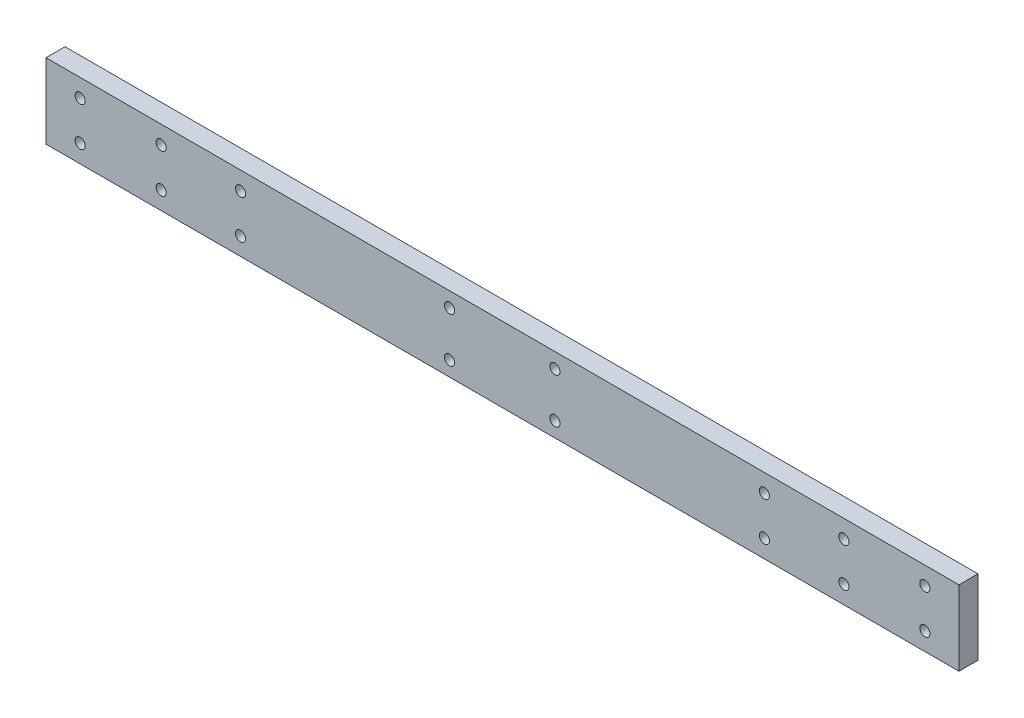
ISO-10303-21;
HEADER;
FILE_DESCRIPTION(('STEP AP214'),'2;1');
FILE_NAME('part.step','',(''),(''),'','','');
FILE_SCHEMA(('AUTOMOTIVE_DESIGN { 1 0 10303 214 1 1 1 1 }'));
ENDSEC;
DATA;
#1=APPLICATION_CONTEXT('core data for automotive mechanical design processes');
#2=APPLICATION_PROTOCOL_DEFINITION('international standard','automotive_design',2000,#1);
#3=PRODUCT_CONTEXT('',#1,'mechanical');
#4=PRODUCT('Part','Part','',(#3));
#5=PRODUCT_RELATED_PRODUCT_CATEGORY('part','',(#4));
#6=PRODUCT_DEFINITION_FORMATION('','',#4);
#7=PRODUCT_DEFINITION_CONTEXT('part definition',#1,'design');
#8=PRODUCT_DEFINITION('design','',#6,#7);
#9=PRODUCT_DEFINITION_SHAPE('','',#8);
#10=(LENGTH_UNIT() NAMED_UNIT(*) SI_UNIT(.MILLI.,.METRE.));
#11=(NAMED_UNIT(*) PLANE_ANGLE_UNIT() SI_UNIT($,.RADIAN.));
#12=(NAMED_UNIT(*) SI_UNIT($,.STERADIAN.) SOLID_ANGLE_UNIT());
#13=UNCERTAINTY_MEASURE_WITH_UNIT(LENGTH_MEASURE(1.E-05),#10,'distance_accuracy_value','');
#14=(GEOMETRIC_REPRESENTATION_CONTEXT(3) GLOBAL_UNCERTAINTY_ASSIGNED_CONTEXT((#13)) GLOBAL_UNIT_ASSIGNED_CONTEXT((#10,
#11,#12)) REPRESENTATION_CONTEXT('',''));
#15=CARTESIAN_POINT('',(0.,0.,0.));
#16=DIRECTION('',(0.,0.,1.));
#17=DIRECTION('',(1.,0.,0.));
#18=AXIS2_PLACEMENT_3D('',#15,#16,#17);
#19=CARTESIAN_POINT('',(264.023766162715,0.,6.35));
#20=DIRECTION('',(1.,0.,0.));
#21=DIRECTION('',(0.,0.,-1.));
#22=AXIS2_PLACEMENT_3D('',#19,#20,#21);
#23=PLANE('',#22);
#24=DIRECTION('',(0.,-1.,0.));
#25=VECTOR('',#24,1.);
#26=CARTESIAN_POINT('',(264.023766162715,0.,0.));
#27=LINE('',#26,#25);
#28=CARTESIAN_POINT('',(264.023766162715,235.923622409626,0.));
#29=VERTEX_POINT('',#28);
#30=CARTESIAN_POINT('',(264.023766162715,210.923622409626,0.));
#31=VERTEX_POINT('',#30);
#32=EDGE_CURVE('E107',#29,#31,#27,.T.);
#33=ORIENTED_EDGE('',*,*,#32,.F.);
#34=DIRECTION('',(0.,0.,-1.));
#35=VECTOR('',#34,1.);
#36=CARTESIAN_POINT('',(264.023766162715,235.923622409626,6.35));
#37=LINE('',#36,#35);
#38=CARTESIAN_POINT('',(264.023766162715,235.923622409626,6.35));
#39=VERTEX_POINT('',#38);
#40=EDGE_CURVE('E12',#39,#29,#37,.T.);
#41=ORIENTED_EDGE('',*,*,#40,.F.);
#42=DIRECTION('',(0.,-1.,0.));
#43=VECTOR('',#42,1.);
#44=CARTESIAN_POINT('',(264.023766162715,0.,6.35));
#45=LINE('',#44,#43);
#46=CARTESIAN_POINT('',(264.023766162715,210.923622409626,6.35));
#47=VERTEX_POINT('',#46);
#48=EDGE_CURVE('E100',#39,#47,#45,.T.);
#49=ORIENTED_EDGE('',*,*,#48,.T.);
#50=DIRECTION('',(0.,0.,-1.));
#51=VECTOR('',#50,1.);
#52=CARTESIAN_POINT('',(264.023766162715,210.923622409626,6.35));
#53=LINE('',#52,#51);
#54=EDGE_CURVE('E80',#47,#31,#53,.T.);
#55=ORIENTED_EDGE('',*,*,#54,.T.);
#56=EDGE_LOOP('',(#33,#41,#49,#55));
#57=FACE_BOUND('',#56,.T.);
#58=ADVANCED_FACE('F39',(#57),#23,.T.);
#59=CARTESIAN_POINT('',(0.,235.923622409626,6.35));
#60=DIRECTION('',(0.,1.,0.));
#61=DIRECTION('',(0.,0.,1.));
#62=AXIS2_PLACEMENT_3D('',#59,#60,#61);
#63=PLANE('',#62);
#64=DIRECTION('',(1.,0.,0.));
#65=VECTOR('',#64,1.);
#66=CARTESIAN_POINT('',(0.,235.923622409626,0.));
#67=LINE('',#66,#65);
#68=CARTESIAN_POINT('',(-40.7762338372855,235.923622409626,0.));
#69=VERTEX_POINT('',#68);
#70=EDGE_CURVE('E93',#69,#29,#67,.T.);
#71=ORIENTED_EDGE('',*,*,#70,.F.);
#72=DIRECTION('',(0.,0.,-1.));
#73=VECTOR('',#72,1.);
#74=CARTESIAN_POINT('',(-40.7762338372855,235.923622409626,6.35));
#75=LINE('',#74,#73);
#76=CARTESIAN_POINT('',(-40.7762338372855,235.923622409626,6.35));
#77=VERTEX_POINT('',#76);
#78=EDGE_CURVE('E49',#77,#69,#75,.T.);
#79=ORIENTED_EDGE('',*,*,#78,.F.);
#80=DIRECTION('',(1.,0.,0.));
#81=VECTOR('',#80,1.);
#82=CARTESIAN_POINT('',(0.,235.923622409626,6.35));
#83=LINE('',#82,#81);
#84=EDGE_CURVE('E91',#77,#39,#83,.T.);
#85=ORIENTED_EDGE('',*,*,#84,.T.);
#86=ORIENTED_EDGE('',*,*,#40,.T.);
#87=EDGE_LOOP('',(#71,#79,#85,#86));
#88=FACE_BOUND('',#87,.T.);
#89=ADVANCED_FACE('F89',(#88),#63,.T.);
#90=CARTESIAN_POINT('',(-40.7762338372855,0.,6.35));
#91=DIRECTION('',(1.,0.,0.));
#92=DIRECTION('',(0.,0.,-1.));
#93=AXIS2_PLACEMENT_3D('',#90,#91,#92);
#94=PLANE('',#93);
#95=DIRECTION('',(0.,-1.,0.));
#96=VECTOR('',#95,1.);
#97=CARTESIAN_POINT('',(-40.7762338372855,0.,0.));
#98=LINE('',#97,#96);
#99=CARTESIAN_POINT('',(-40.7762338372855,210.923622409626,0.));
#100=VERTEX_POINT('',#99);
#101=EDGE_CURVE('E73',#69,#100,#98,.T.);
#102=ORIENTED_EDGE('',*,*,#101,.T.);
#103=DIRECTION('',(0.,0.,-1.));
#104=VECTOR('',#103,1.);
#105=CARTESIAN_POINT('',(-40.7762338372855,210.923622409626,6.35));
#106=LINE('',#105,#104);
#107=CARTESIAN_POINT('',(-40.7762338372855,210.923622409626,6.35));
#108=VERTEX_POINT('',#107);
#109=EDGE_CURVE('E94',#108,#100,#106,.T.);
#110=ORIENTED_EDGE('',*,*,#109,.F.);
#111=DIRECTION('',(0.,-1.,0.));
#112=VECTOR('',#111,1.);
#113=CARTESIAN_POINT('',(-40.7762338372855,0.,6.35));
#114=LINE('',#113,#112);
#115=EDGE_CURVE('E96',#77,#108,#114,.T.);
#116=ORIENTED_EDGE('',*,*,#115,.F.);
#117=ORIENTED_EDGE('',*,*,#78,.T.);
#118=EDGE_LOOP('',(#102,#110,#116,#117));
#119=FACE_BOUND('',#118,.T.);
#120=ADVANCED_FACE('F97',(#119),#94,.F.);
#121=CARTESIAN_POINT('',(0.,210.923622409626,6.35));
#122=DIRECTION('',(0.,1.,0.));
#123=DIRECTION('',(0.,0.,1.));
#124=AXIS2_PLACEMENT_3D('',#121,#122,#123);
#125=PLANE('',#124);
#126=DIRECTION('',(1.,0.,0.));
#127=VECTOR('',#126,1.);
#128=CARTESIAN_POINT('',(0.,210.923622409626,0.));
#129=LINE('',#128,#127);
#130=EDGE_CURVE('E102',#100,#31,#129,.T.);
#131=ORIENTED_EDGE('',*,*,#130,.T.);
#132=ORIENTED_EDGE('',*,*,#54,.F.);
#133=DIRECTION('',(1.,0.,0.));
#134=VECTOR('',#133,1.);
#135=CARTESIAN_POINT('',(0.,210.923622409626,6.35));
#136=LINE('',#135,#134);
#137=EDGE_CURVE('E58',#108,#47,#136,.T.);
#138=ORIENTED_EDGE('',*,*,#137,.F.);
#139=ORIENTED_EDGE('',*,*,#109,.T.);
#140=EDGE_LOOP('',(#131,#132,#138,#139));
#141=FACE_BOUND('',#140,.T.);
#142=ADVANCED_FACE('F228',(#141),#125,.F.);
#143=CARTESIAN_POINT('',(0.,0.,6.35));
#144=DIRECTION('',(0.,0.,1.));
#145=DIRECTION('',(1.,0.,0.));
#146=AXIS2_PLACEMENT_3D('',#143,#144,#145);
#147=PLANE('',#146);
#148=CARTESIAN_POINT('',(129.123766162715,230.923622409626,6.35));
#149=DIRECTION('',(0.,0.,1.));
#150=DIRECTION('',(1.,0.,0.));
#151=AXIS2_PLACEMENT_3D('',#148,#149,#150);
#152=CIRCLE('',#151,1.70000000000001);
#153=CARTESIAN_POINT('',(130.823766162715,230.923622409626,6.35));
#154=VERTEX_POINT('',#153);
#155=EDGE_CURVE('E429',#154,#154,#152,.T.);
#156=ORIENTED_EDGE('',*,*,#155,.F.);
#157=EDGE_LOOP('',(#156));
#158=FACE_BOUND('',#157,.T.);
#159=CARTESIAN_POINT('',(93.9601678730371,215.923622409626,6.35));
#160=DIRECTION('',(0.,0.,1.));
#161=DIRECTION('',(1.,0.,0.));
#162=AXIS2_PLACEMENT_3D('',#159,#160,#161);
#163=CIRCLE('',#162,1.70000000000001);
#164=CARTESIAN_POINT('',(95.6601678730371,215.923622409626,6.35));
#165=VERTEX_POINT('',#164);
#166=EDGE_CURVE('E431',#165,#165,#163,.T.);
#167=ORIENTED_EDGE('',*,*,#166,.F.);
#168=EDGE_LOOP('',(#167));
#169=FACE_BOUND('',#168,.T.);
#170=CARTESIAN_POINT('',(93.9601678730371,230.923622409626,6.35));
#171=DIRECTION('',(0.,0.,1.));
#172=DIRECTION('',(1.,0.,0.));
#173=AXIS2_PLACEMENT_3D('',#170,#171,#172);
#174=CIRCLE('',#173,1.70000000000001);
#175=CARTESIAN_POINT('',(95.6601678730371,230.923622409626,6.35));
#176=VERTEX_POINT('',#175);
#177=EDGE_CURVE('E437',#176,#176,#174,.T.);
#178=ORIENTED_EDGE('',*,*,#177,.F.);
#179=EDGE_LOOP('',(#178));
#180=FACE_BOUND('',#179,.T.);
#181=CARTESIAN_POINT('',(24.1969289474849,229.84055273072,6.35));
#182=DIRECTION('',(0.,0.,1.));
#183=DIRECTION('',(1.,0.,0.));
#184=AXIS2_PLACEMENT_3D('',#181,#182,#183);
#185=CIRCLE('',#184,1.70000000000001);
#186=CARTESIAN_POINT('',(25.8969289474849,229.84055273072,6.35));
#187=VERTEX_POINT('',#186);
#188=EDGE_CURVE('E440',#187,#187,#185,.T.);
#189=ORIENTED_EDGE('',*,*,#188,.F.);
#190=EDGE_LOOP('',(#189));
#191=FACE_BOUND('',#190,.T.);
#192=CARTESIAN_POINT('',(199.050473292504,216.923622409632,6.35));
#193=DIRECTION('',(0.,0.,1.));
#194=DIRECTION('',(1.,0.,0.));
#195=AXIS2_PLACEMENT_3D('',#192,#193,#194);
#196=CIRCLE('',#195,1.70000000000001);
#197=CARTESIAN_POINT('',(200.750473292504,216.923622409632,6.35));
#198=VERTEX_POINT('',#197);
#199=EDGE_CURVE('E166',#198,#198,#196,.T.);
#200=ORIENTED_EDGE('',*,*,#199,.F.);
#201=EDGE_LOOP('',(#200));
#202=FACE_BOUND('',#201,.T.);
#203=CARTESIAN_POINT('',(199.050473292504,229.923622409632,6.35));
#204=DIRECTION('',(0.,0.,1.));
#205=DIRECTION('',(1.,0.,0.));
#206=AXIS2_PLACEMENT_3D('',#203,#204,#205);
#207=CIRCLE('',#206,1.70000000000001);
#208=CARTESIAN_POINT('',(200.750473292504,229.923622409632,6.35));
#209=VERTEX_POINT('',#208);
#210=EDGE_CURVE('E434',#209,#209,#207,.T.);
#211=ORIENTED_EDGE('',*,*,#210,.F.);
#212=EDGE_LOOP('',(#211));
#213=FACE_BOUND('',#212,.T.);
#214=CARTESIAN_POINT('',(129.123766162715,215.923622409626,6.35));
#215=DIRECTION('',(0.,0.,1.));
#216=DIRECTION('',(1.,0.,0.));
#217=AXIS2_PLACEMENT_3D('',#214,#215,#216);
#218=CIRCLE('',#217,1.70000000000001);
#219=CARTESIAN_POINT('',(130.823766162715,215.923622409626,6.35));
#220=VERTEX_POINT('',#219);
#221=EDGE_CURVE('E430',#220,#220,#218,.T.);
#222=ORIENTED_EDGE('',*,*,#221,.F.);
#223=EDGE_LOOP('',(#222));
#224=FACE_BOUND('',#223,.T.);
#225=CARTESIAN_POINT('',(24.1562135720956,216.840616490176,6.35));
#226=DIRECTION('',(0.,0.,1.));
#227=DIRECTION('',(1.,0.,0.));
#228=AXIS2_PLACEMENT_3D('',#225,#226,#227);
#229=CIRCLE('',#228,1.70000000000001);
#230=CARTESIAN_POINT('',(25.8562135720956,216.840616490176,6.35));
#231=VERTEX_POINT('',#230);
#232=EDGE_CURVE('E475',#231,#231,#229,.T.);
#233=ORIENTED_EDGE('',*,*,#232,.F.);
#234=EDGE_LOOP('',(#233));
#235=FACE_BOUND('',#234,.T.);
#236=CARTESIAN_POINT('',(225.573766162715,229.923622409632,6.35));
#237=DIRECTION('',(0.,0.,1.));
#238=DIRECTION('',(1.,0.,0.));
#239=AXIS2_PLACEMENT_3D('',#236,#237,#238);
#240=CIRCLE('',#239,1.69999999999999);
#241=CARTESIAN_POINT('',(227.273766162715,229.923622409632,6.35));
#242=VERTEX_POINT('',#241);
#243=EDGE_CURVE('E209',#242,#242,#240,.T.);
#244=ORIENTED_EDGE('',*,*,#243,.F.);
#245=EDGE_LOOP('',(#244));
#246=FACE_BOUND('',#245,.T.);
#247=CARTESIAN_POINT('',(252.623766162721,229.923622409626,6.35));
#248=DIRECTION('',(0.,0.,1.));
#249=DIRECTION('',(1.,0.,0.));
#250=AXIS2_PLACEMENT_3D('',#247,#248,#249);
#251=CIRCLE('',#250,1.69999999999996);
#252=CARTESIAN_POINT('',(254.323766162721,229.923622409626,6.35));
#253=VERTEX_POINT('',#252);
#254=EDGE_CURVE('E212',#253,#253,#251,.T.);
#255=ORIENTED_EDGE('',*,*,#254,.F.);
#256=EDGE_LOOP('',(#255));
#257=FACE_BOUND('',#256,.T.);
#258=CARTESIAN_POINT('',(252.623766162721,216.923622409626,6.35));
#259=DIRECTION('',(0.,0.,1.));
#260=DIRECTION('',(1.,0.,0.));
#261=AXIS2_PLACEMENT_3D('',#258,#259,#260);
#262=CIRCLE('',#261,1.69999999999996);
#263=CARTESIAN_POINT('',(254.323766162721,216.923622409626,6.35));
#264=VERTEX_POINT('',#263);
#265=EDGE_CURVE('E215',#264,#264,#262,.T.);
#266=ORIENTED_EDGE('',*,*,#265,.F.);
#267=EDGE_LOOP('',(#266));
#268=FACE_BOUND('',#267,.T.);
#269=CARTESIAN_POINT('',(-2.32623383728603,216.923622409626,6.35));
#270=DIRECTION('',(0.,0.,1.));
#271=DIRECTION('',(1.,0.,0.));
#272=AXIS2_PLACEMENT_3D('',#269,#270,#271);
#273=CIRCLE('',#272,1.69999999999998);
#274=CARTESIAN_POINT('',(-0.626233837286046,216.923622409626,6.35));
#275=VERTEX_POINT('',#274);
#276=EDGE_CURVE('E218',#275,#275,#273,.T.);
#277=ORIENTED_EDGE('',*,*,#276,.F.);
#278=EDGE_LOOP('',(#277));
#279=FACE_BOUND('',#278,.T.);
#280=CARTESIAN_POINT('',(-29.3762338372853,216.923622409624,6.35));
#281=DIRECTION('',(0.,0.,1.));
#282=DIRECTION('',(1.,0.,0.));
#283=AXIS2_PLACEMENT_3D('',#280,#281,#282);
#284=CIRCLE('',#283,1.69999999999998);
#285=CARTESIAN_POINT('',(-27.6762338372853,216.923622409624,6.35));
#286=VERTEX_POINT('',#285);
#287=EDGE_CURVE('E205',#286,#286,#284,.T.);
#288=ORIENTED_EDGE('',*,*,#287,.F.);
#289=EDGE_LOOP('',(#288));
#290=FACE_BOUND('',#289,.T.);
#291=CARTESIAN_POINT('',(-29.3762338372856,229.923622409624,6.35));
#292=DIRECTION('',(0.,0.,1.));
#293=DIRECTION('',(1.,0.,0.));
#294=AXIS2_PLACEMENT_3D('',#291,#292,#293);
#295=CIRCLE('',#294,1.69999999999998);
#296=CARTESIAN_POINT('',(-27.6762338372856,229.923622409624,6.35));
#297=VERTEX_POINT('',#296);
#298=EDGE_CURVE('E200',#297,#297,#295,.T.);
#299=ORIENTED_EDGE('',*,*,#298,.F.);
#300=EDGE_LOOP('',(#299));
#301=FACE_BOUND('',#300,.T.);
#302=CARTESIAN_POINT('',(-2.32623383728603,229.923622409626,6.35));
#303=DIRECTION('',(0.,0.,1.));
#304=DIRECTION('',(1.,0.,0.));
#305=AXIS2_PLACEMENT_3D('',#302,#303,#304);
#306=CIRCLE('',#305,1.69999999999998);
#307=CARTESIAN_POINT('',(-0.626233837286046,229.923622409626,6.35));
#308=VERTEX_POINT('',#307);
#309=EDGE_CURVE('E196',#308,#308,#306,.T.);
#310=ORIENTED_EDGE('',*,*,#309,.F.);
#311=EDGE_LOOP('',(#310));
#312=FACE_BOUND('',#311,.T.);
#313=CARTESIAN_POINT('',(225.573766162715,216.923622409632,6.35));
#314=DIRECTION('',(0.,0.,1.));
#315=DIRECTION('',(1.,0.,0.));
#316=AXIS2_PLACEMENT_3D('',#313,#314,#315);
#317=CIRCLE('',#316,1.69999999999999);
#318=CARTESIAN_POINT('',(227.273766162715,216.923622409632,6.35));
#319=VERTEX_POINT('',#318);
#320=EDGE_CURVE('E128',#319,#319,#317,.T.);
#321=ORIENTED_EDGE('',*,*,#320,.F.);
#322=EDGE_LOOP('',(#321));
#323=FACE_BOUND('',#322,.T.);
#324=ORIENTED_EDGE('',*,*,#48,.F.);
#325=ORIENTED_EDGE('',*,*,#84,.F.);
#326=ORIENTED_EDGE('',*,*,#115,.T.);
#327=ORIENTED_EDGE('',*,*,#137,.T.);
#328=EDGE_LOOP('',(#324,#325,#326,#327));
#329=FACE_BOUND('',#328,.T.);
#330=ADVANCED_FACE('F99',(#158,#169,#180,#191,#202,#213,#224,#235,#246,#257,#268,#279,#290,#301,
#312,#323,#329),#147,.T.);
#331=CARTESIAN_POINT('',(0.,0.,0.));
#332=DIRECTION('',(0.,0.,1.));
#333=DIRECTION('',(1.,0.,0.));
#334=AXIS2_PLACEMENT_3D('',#331,#332,#333);
#335=PLANE('',#334);
#336=CARTESIAN_POINT('',(129.123766162715,230.923622409626,0.));
#337=DIRECTION('',(0.,0.,1.));
#338=DIRECTION('',(1.,0.,0.));
#339=AXIS2_PLACEMENT_3D('',#336,#337,#338);
#340=CIRCLE('',#339,1.70000000000001);
#341=CARTESIAN_POINT('',(130.823766162715,230.923622409626,0.));
#342=VERTEX_POINT('',#341);
#343=EDGE_CURVE('E42',#342,#342,#340,.T.);
#344=ORIENTED_EDGE('',*,*,#343,.T.);
#345=EDGE_LOOP('',(#344));
#346=FACE_BOUND('',#345,.T.);
#347=CARTESIAN_POINT('',(93.9601678730371,215.923622409626,0.));
#348=DIRECTION('',(0.,0.,1.));
#349=DIRECTION('',(1.,0.,0.));
#350=AXIS2_PLACEMENT_3D('',#347,#348,#349);
#351=CIRCLE('',#350,1.70000000000001);
#352=CARTESIAN_POINT('',(95.6601678730371,215.923622409626,0.));
#353=VERTEX_POINT('',#352);
#354=EDGE_CURVE('E188',#353,#353,#351,.T.);
#355=ORIENTED_EDGE('',*,*,#354,.T.);
#356=EDGE_LOOP('',(#355));
#357=FACE_BOUND('',#356,.T.);
#358=CARTESIAN_POINT('',(93.9601678730371,230.923622409626,0.));
#359=DIRECTION('',(0.,0.,1.));
#360=DIRECTION('',(1.,0.,0.));
#361=AXIS2_PLACEMENT_3D('',#358,#359,#360);
#362=CIRCLE('',#361,1.70000000000001);
#363=CARTESIAN_POINT('',(95.6601678730371,230.923622409626,0.));
#364=VERTEX_POINT('',#363);
#365=EDGE_CURVE('E185',#364,#364,#362,.T.);
#366=ORIENTED_EDGE('',*,*,#365,.T.);
#367=EDGE_LOOP('',(#366));
#368=FACE_BOUND('',#367,.T.);
#369=CARTESIAN_POINT('',(24.1969289474849,229.84055273072,0.));
#370=DIRECTION('',(0.,0.,1.));
#371=DIRECTION('',(1.,0.,0.));
#372=AXIS2_PLACEMENT_3D('',#369,#370,#371);
#373=CIRCLE('',#372,1.70000000000001);
#374=CARTESIAN_POINT('',(25.8969289474849,229.84055273072,0.));
#375=VERTEX_POINT('',#374);
#376=EDGE_CURVE('E181',#375,#375,#373,.T.);
#377=ORIENTED_EDGE('',*,*,#376,.T.);
#378=EDGE_LOOP('',(#377));
#379=FACE_BOUND('',#378,.T.);
#380=CARTESIAN_POINT('',(199.050473292504,216.923622409632,0.));
#381=DIRECTION('',(0.,0.,1.));
#382=DIRECTION('',(1.,0.,0.));
#383=AXIS2_PLACEMENT_3D('',#380,#381,#382);
#384=CIRCLE('',#383,1.70000000000001);
#385=CARTESIAN_POINT('',(200.750473292504,216.923622409632,0.));
#386=VERTEX_POINT('',#385);
#387=EDGE_CURVE('E178',#386,#386,#384,.T.);
#388=ORIENTED_EDGE('',*,*,#387,.T.);
#389=EDGE_LOOP('',(#388));
#390=FACE_BOUND('',#389,.T.);
#391=CARTESIAN_POINT('',(199.050473292504,229.923622409632,0.));
#392=DIRECTION('',(0.,0.,1.));
#393=DIRECTION('',(1.,0.,0.));
#394=AXIS2_PLACEMENT_3D('',#391,#392,#393);
#395=CIRCLE('',#394,1.70000000000001);
#396=CARTESIAN_POINT('',(200.750473292504,229.923622409632,0.));
#397=VERTEX_POINT('',#396);
#398=EDGE_CURVE('E170',#397,#397,#395,.T.);
#399=ORIENTED_EDGE('',*,*,#398,.T.);
#400=EDGE_LOOP('',(#399));
#401=FACE_BOUND('',#400,.T.);
#402=CARTESIAN_POINT('',(129.123766162715,215.923622409626,0.));
#403=DIRECTION('',(0.,0.,1.));
#404=DIRECTION('',(1.,0.,0.));
#405=AXIS2_PLACEMENT_3D('',#402,#403,#404);
#406=CIRCLE('',#405,1.70000000000001);
#407=CARTESIAN_POINT('',(130.823766162715,215.923622409626,0.));
#408=VERTEX_POINT('',#407);
#409=EDGE_CURVE('E165',#408,#408,#406,.T.);
#410=ORIENTED_EDGE('',*,*,#409,.T.);
#411=EDGE_LOOP('',(#410));
#412=FACE_BOUND('',#411,.T.);
#413=CARTESIAN_POINT('',(24.1562135720956,216.840616490176,0.));
#414=DIRECTION('',(0.,0.,1.));
#415=DIRECTION('',(1.,0.,0.));
#416=AXIS2_PLACEMENT_3D('',#413,#414,#415);
#417=CIRCLE('',#416,1.70000000000001);
#418=CARTESIAN_POINT('',(25.8562135720956,216.840616490176,0.));
#419=VERTEX_POINT('',#418);
#420=EDGE_CURVE('E161',#419,#419,#417,.T.);
#421=ORIENTED_EDGE('',*,*,#420,.T.);
#422=EDGE_LOOP('',(#421));
#423=FACE_BOUND('',#422,.T.);
#424=CARTESIAN_POINT('',(225.573766162715,229.923622409632,0.));
#425=DIRECTION('',(0.,0.,1.));
#426=DIRECTION('',(1.,0.,0.));
#427=AXIS2_PLACEMENT_3D('',#424,#425,#426);
#428=CIRCLE('',#427,1.69999999999999);
#429=CARTESIAN_POINT('',(227.273766162715,229.923622409632,0.));
#430=VERTEX_POINT('',#429);
#431=EDGE_CURVE('E110',#430,#430,#428,.T.);
#432=ORIENTED_EDGE('',*,*,#431,.T.);
#433=EDGE_LOOP('',(#432));
#434=FACE_BOUND('',#433,.T.);
#435=CARTESIAN_POINT('',(252.623766162721,229.923622409626,0.));
#436=DIRECTION('',(0.,0.,1.));
#437=DIRECTION('',(1.,0.,0.));
#438=AXIS2_PLACEMENT_3D('',#435,#436,#437);
#439=CIRCLE('',#438,1.69999999999996);
#440=CARTESIAN_POINT('',(254.323766162721,229.923622409626,0.));
#441=VERTEX_POINT('',#440);
#442=EDGE_CURVE('E151',#441,#441,#439,.T.);
#443=ORIENTED_EDGE('',*,*,#442,.T.);
#444=EDGE_LOOP('',(#443));
#445=FACE_BOUND('',#444,.T.);
#446=CARTESIAN_POINT('',(252.623766162721,216.923622409626,0.));
#447=DIRECTION('',(0.,0.,1.));
#448=DIRECTION('',(1.,0.,0.));
#449=AXIS2_PLACEMENT_3D('',#446,#447,#448);
#450=CIRCLE('',#449,1.69999999999996);
#451=CARTESIAN_POINT('',(254.323766162721,216.923622409626,0.));
#452=VERTEX_POINT('',#451);
#453=EDGE_CURVE('E147',#452,#452,#450,.T.);
#454=ORIENTED_EDGE('',*,*,#453,.T.);
#455=EDGE_LOOP('',(#454));
#456=FACE_BOUND('',#455,.T.);
#457=CARTESIAN_POINT('',(-2.32623383728603,216.923622409626,0.));
#458=DIRECTION('',(0.,0.,1.));
#459=DIRECTION('',(1.,0.,0.));
#460=AXIS2_PLACEMENT_3D('',#457,#458,#459);
#461=CIRCLE('',#460,1.69999999999998);
#462=CARTESIAN_POINT('',(-0.626233837286046,216.923622409626,0.));
#463=VERTEX_POINT('',#462);
#464=EDGE_CURVE('E143',#463,#463,#461,.T.);
#465=ORIENTED_EDGE('',*,*,#464,.T.);
#466=EDGE_LOOP('',(#465));
#467=FACE_BOUND('',#466,.T.);
#468=CARTESIAN_POINT('',(-29.3762338372853,216.923622409624,0.));
#469=DIRECTION('',(0.,0.,1.));
#470=DIRECTION('',(1.,0.,0.));
#471=AXIS2_PLACEMENT_3D('',#468,#469,#470);
#472=CIRCLE('',#471,1.69999999999998);
#473=CARTESIAN_POINT('',(-27.6762338372853,216.923622409624,0.));
#474=VERTEX_POINT('',#473);
#475=EDGE_CURVE('E140',#474,#474,#472,.T.);
#476=ORIENTED_EDGE('',*,*,#475,.T.);
#477=EDGE_LOOP('',(#476));
#478=FACE_BOUND('',#477,.T.);
#479=CARTESIAN_POINT('',(-29.3762338372856,229.923622409624,0.));
#480=DIRECTION('',(0.,0.,1.));
#481=DIRECTION('',(1.,0.,0.));
#482=AXIS2_PLACEMENT_3D('',#479,#480,#481);
#483=CIRCLE('',#482,1.69999999999998);
#484=CARTESIAN_POINT('',(-27.6762338372856,229.923622409624,0.));
#485=VERTEX_POINT('',#484);
#486=EDGE_CURVE('E132',#485,#485,#483,.T.);
#487=ORIENTED_EDGE('',*,*,#486,.T.);
#488=EDGE_LOOP('',(#487));
#489=FACE_BOUND('',#488,.T.);
#490=CARTESIAN_POINT('',(-2.32623383728603,229.923622409626,0.));
#491=DIRECTION('',(0.,0.,1.));
#492=DIRECTION('',(1.,0.,0.));
#493=AXIS2_PLACEMENT_3D('',#490,#491,#492);
#494=CIRCLE('',#493,1.69999999999998);
#495=CARTESIAN_POINT('',(-0.626233837286046,229.923622409626,0.));
#496=VERTEX_POINT('',#495);
#497=EDGE_CURVE('E127',#496,#496,#494,.T.);
#498=ORIENTED_EDGE('',*,*,#497,.T.);
#499=EDGE_LOOP('',(#498));
#500=FACE_BOUND('',#499,.T.);
#501=CARTESIAN_POINT('',(225.573766162715,216.923622409632,0.));
#502=DIRECTION('',(0.,0.,1.));
#503=DIRECTION('',(1.,0.,0.));
#504=AXIS2_PLACEMENT_3D('',#501,#502,#503);
#505=CIRCLE('',#504,1.69999999999999);
#506=CARTESIAN_POINT('',(227.273766162715,216.923622409632,0.));
#507=VERTEX_POINT('',#506);
#508=EDGE_CURVE('E123',#507,#507,#505,.T.);
#509=ORIENTED_EDGE('',*,*,#508,.T.);
#510=EDGE_LOOP('',(#509));
#511=FACE_BOUND('',#510,.T.);
#512=ORIENTED_EDGE('',*,*,#32,.T.);
#513=ORIENTED_EDGE('',*,*,#130,.F.);
#514=ORIENTED_EDGE('',*,*,#101,.F.);
#515=ORIENTED_EDGE('',*,*,#70,.T.);
#516=EDGE_LOOP('',(#512,#513,#514,#515));
#517=FACE_BOUND('',#516,.T.);
#518=ADVANCED_FACE('F227',(#346,#357,#368,#379,#390,#401,#412,#423,#434,#445,#456,#467,#478,
#489,#500,#511,#517),#335,.F.);
#519=CARTESIAN_POINT('',(225.573766162715,216.923622409632,-3.65));
#520=DIRECTION('',(0.,0.,1.));
#521=DIRECTION('',(1.,0.,0.));
#522=AXIS2_PLACEMENT_3D('',#519,#520,#521);
#523=CYLINDRICAL_SURFACE('',#522,1.69999999999999);
#524=ORIENTED_EDGE('',*,*,#320,.T.);
#525=EDGE_LOOP('',(#524));
#526=FACE_BOUND('',#525,.T.);
#527=ORIENTED_EDGE('',*,*,#508,.F.);
#528=EDGE_LOOP('',(#527));
#529=FACE_BOUND('',#528,.T.);
#530=ADVANCED_FACE('F223',(#526,#529),#523,.F.);
#531=CARTESIAN_POINT('',(-2.32623383728603,229.923622409626,-3.65));
#532=DIRECTION('',(0.,0.,1.));
#533=DIRECTION('',(1.,0.,0.));
#534=AXIS2_PLACEMENT_3D('',#531,#532,#533);
#535=CYLINDRICAL_SURFACE('',#534,1.69999999999998);
#536=ORIENTED_EDGE('',*,*,#309,.T.);
#537=EDGE_LOOP('',(#536));
#538=FACE_BOUND('',#537,.T.);
#539=ORIENTED_EDGE('',*,*,#497,.F.);
#540=EDGE_LOOP('',(#539));
#541=FACE_BOUND('',#540,.T.);
#542=ADVANCED_FACE('F267',(#538,#541),#535,.F.);
#543=CARTESIAN_POINT('',(-29.3762338372856,229.923622409624,-3.65));
#544=DIRECTION('',(0.,0.,1.));
#545=DIRECTION('',(1.,0.,0.));
#546=AXIS2_PLACEMENT_3D('',#543,#544,#545);
#547=CYLINDRICAL_SURFACE('',#546,1.69999999999998);
#548=ORIENTED_EDGE('',*,*,#298,.T.);
#549=EDGE_LOOP('',(#548));
#550=FACE_BOUND('',#549,.T.);
#551=ORIENTED_EDGE('',*,*,#486,.F.);
#552=EDGE_LOOP('',(#551));
#553=FACE_BOUND('',#552,.T.);
#554=ADVANCED_FACE('F276',(#550,#553),#547,.F.);
#555=CARTESIAN_POINT('',(-29.3762338372853,216.923622409624,-3.65));
#556=DIRECTION('',(0.,0.,1.));
#557=DIRECTION('',(1.,0.,0.));
#558=AXIS2_PLACEMENT_3D('',#555,#556,#557);
#559=CYLINDRICAL_SURFACE('',#558,1.69999999999998);
#560=ORIENTED_EDGE('',*,*,#287,.T.);
#561=EDGE_LOOP('',(#560));
#562=FACE_BOUND('',#561,.T.);
#563=ORIENTED_EDGE('',*,*,#475,.F.);
#564=EDGE_LOOP('',(#563));
#565=FACE_BOUND('',#564,.T.);
#566=ADVANCED_FACE('F285',(#562,#565),#559,.F.);
#567=CARTESIAN_POINT('',(-2.32623383728603,216.923622409626,-3.65));
#568=DIRECTION('',(0.,0.,1.));
#569=DIRECTION('',(1.,0.,0.));
#570=AXIS2_PLACEMENT_3D('',#567,#568,#569);
#571=CYLINDRICAL_SURFACE('',#570,1.69999999999998);
#572=ORIENTED_EDGE('',*,*,#276,.T.);
#573=EDGE_LOOP('',(#572));
#574=FACE_BOUND('',#573,.T.);
#575=ORIENTED_EDGE('',*,*,#464,.F.);
#576=EDGE_LOOP('',(#575));
#577=FACE_BOUND('',#576,.T.);
#578=ADVANCED_FACE('F295',(#574,#577),#571,.F.);
#579=CARTESIAN_POINT('',(252.623766162721,216.923622409626,-3.65));
#580=DIRECTION('',(0.,0.,1.));
#581=DIRECTION('',(1.,0.,0.));
#582=AXIS2_PLACEMENT_3D('',#579,#580,#581);
#583=CYLINDRICAL_SURFACE('',#582,1.69999999999996);
#584=ORIENTED_EDGE('',*,*,#265,.T.);
#585=EDGE_LOOP('',(#584));
#586=FACE_BOUND('',#585,.T.);
#587=ORIENTED_EDGE('',*,*,#453,.F.);
#588=EDGE_LOOP('',(#587));
#589=FACE_BOUND('',#588,.T.);
#590=ADVANCED_FACE('F305',(#586,#589),#583,.F.);
#591=CARTESIAN_POINT('',(252.623766162721,229.923622409626,-3.65));
#592=DIRECTION('',(0.,0.,1.));
#593=DIRECTION('',(1.,0.,0.));
#594=AXIS2_PLACEMENT_3D('',#591,#592,#593);
#595=CYLINDRICAL_SURFACE('',#594,1.69999999999996);
#596=ORIENTED_EDGE('',*,*,#254,.T.);
#597=EDGE_LOOP('',(#596));
#598=FACE_BOUND('',#597,.T.);
#599=ORIENTED_EDGE('',*,*,#442,.F.);
#600=EDGE_LOOP('',(#599));
#601=FACE_BOUND('',#600,.T.);
#602=ADVANCED_FACE('F315',(#598,#601),#595,.F.);
#603=CARTESIAN_POINT('',(225.573766162715,229.923622409632,-3.65));
#604=DIRECTION('',(0.,0.,1.));
#605=DIRECTION('',(1.,0.,0.));
#606=AXIS2_PLACEMENT_3D('',#603,#604,#605);
#607=CYLINDRICAL_SURFACE('',#606,1.69999999999999);
#608=ORIENTED_EDGE('',*,*,#243,.T.);
#609=EDGE_LOOP('',(#608));
#610=FACE_BOUND('',#609,.T.);
#611=ORIENTED_EDGE('',*,*,#431,.F.);
#612=EDGE_LOOP('',(#611));
#613=FACE_BOUND('',#612,.T.);
#614=ADVANCED_FACE('F325',(#610,#613),#607,.F.);
#615=CARTESIAN_POINT('',(24.1562135720956,216.840616490176,-15.65));
#616=DIRECTION('',(0.,0.,1.));
#617=DIRECTION('',(1.,0.,0.));
#618=AXIS2_PLACEMENT_3D('',#615,#616,#617);
#619=CYLINDRICAL_SURFACE('',#618,1.70000000000001);
#620=ORIENTED_EDGE('',*,*,#232,.T.);
#621=EDGE_LOOP('',(#620));
#622=FACE_BOUND('',#621,.T.);
#623=ORIENTED_EDGE('',*,*,#420,.F.);
#624=EDGE_LOOP('',(#623));
#625=FACE_BOUND('',#624,.T.);
#626=ADVANCED_FACE('F334',(#622,#625),#619,.F.);
#627=CARTESIAN_POINT('',(129.123766162715,215.923622409626,-15.65));
#628=DIRECTION('',(0.,0.,1.));
#629=DIRECTION('',(1.,0.,0.));
#630=AXIS2_PLACEMENT_3D('',#627,#628,#629);
#631=CYLINDRICAL_SURFACE('',#630,1.70000000000001);
#632=ORIENTED_EDGE('',*,*,#221,.T.);
#633=EDGE_LOOP('',(#632));
#634=FACE_BOUND('',#633,.T.);
#635=ORIENTED_EDGE('',*,*,#409,.F.);
#636=EDGE_LOOP('',(#635));
#637=FACE_BOUND('',#636,.T.);
#638=ADVANCED_FACE('F353',(#634,#637),#631,.F.);
#639=CARTESIAN_POINT('',(199.050473292504,229.923622409632,-15.65));
#640=DIRECTION('',(0.,0.,1.));
#641=DIRECTION('',(1.,0.,0.));
#642=AXIS2_PLACEMENT_3D('',#639,#640,#641);
#643=CYLINDRICAL_SURFACE('',#642,1.70000000000001);
#644=ORIENTED_EDGE('',*,*,#210,.T.);
#645=EDGE_LOOP('',(#644));
#646=FACE_BOUND('',#645,.T.);
#647=ORIENTED_EDGE('',*,*,#398,.F.);
#648=EDGE_LOOP('',(#647));
#649=FACE_BOUND('',#648,.T.);
#650=ADVANCED_FACE('F363',(#646,#649),#643,.F.);
#651=CARTESIAN_POINT('',(199.050473292504,216.923622409632,-15.65));
#652=DIRECTION('',(0.,0.,1.));
#653=DIRECTION('',(1.,0.,0.));
#654=AXIS2_PLACEMENT_3D('',#651,#652,#653);
#655=CYLINDRICAL_SURFACE('',#654,1.70000000000001);
#656=ORIENTED_EDGE('',*,*,#199,.T.);
#657=EDGE_LOOP('',(#656));
#658=FACE_BOUND('',#657,.T.);
#659=ORIENTED_EDGE('',*,*,#387,.F.);
#660=EDGE_LOOP('',(#659));
#661=FACE_BOUND('',#660,.T.);
#662=ADVANCED_FACE('F373',(#658,#661),#655,.F.);
#663=CARTESIAN_POINT('',(24.1969289474849,229.84055273072,-15.65));
#664=DIRECTION('',(0.,0.,1.));
#665=DIRECTION('',(1.,0.,0.));
#666=AXIS2_PLACEMENT_3D('',#663,#664,#665);
#667=CYLINDRICAL_SURFACE('',#666,1.70000000000001);
#668=ORIENTED_EDGE('',*,*,#188,.T.);
#669=EDGE_LOOP('',(#668));
#670=FACE_BOUND('',#669,.T.);
#671=ORIENTED_EDGE('',*,*,#376,.F.);
#672=EDGE_LOOP('',(#671));
#673=FACE_BOUND('',#672,.T.);
#674=ADVANCED_FACE('F383',(#670,#673),#667,.F.);
#675=CARTESIAN_POINT('',(93.9601678730371,230.923622409626,-15.65));
#676=DIRECTION('',(0.,0.,1.));
#677=DIRECTION('',(1.,0.,0.));
#678=AXIS2_PLACEMENT_3D('',#675,#676,#677);
#679=CYLINDRICAL_SURFACE('',#678,1.70000000000001);
#680=ORIENTED_EDGE('',*,*,#177,.T.);
#681=EDGE_LOOP('',(#680));
#682=FACE_BOUND('',#681,.T.);
#683=ORIENTED_EDGE('',*,*,#365,.F.);
#684=EDGE_LOOP('',(#683));
#685=FACE_BOUND('',#684,.T.);
#686=ADVANCED_FACE('F393',(#682,#685),#679,.F.);
#687=CARTESIAN_POINT('',(93.9601678730371,215.923622409626,-15.65));
#688=DIRECTION('',(0.,0.,1.));
#689=DIRECTION('',(1.,0.,0.));
#690=AXIS2_PLACEMENT_3D('',#687,#688,#689);
#691=CYLINDRICAL_SURFACE('',#690,1.70000000000001);
#692=ORIENTED_EDGE('',*,*,#166,.T.);
#693=EDGE_LOOP('',(#692));
#694=FACE_BOUND('',#693,.T.);
#695=ORIENTED_EDGE('',*,*,#354,.F.);
#696=EDGE_LOOP('',(#695));
#697=FACE_BOUND('',#696,.T.);
#698=ADVANCED_FACE('F403',(#694,#697),#691,.F.);
#699=CARTESIAN_POINT('',(129.123766162715,230.923622409626,-15.65));
#700=DIRECTION('',(0.,0.,1.));
#701=DIRECTION('',(1.,0.,0.));
#702=AXIS2_PLACEMENT_3D('',#699,#700,#701);
#703=CYLINDRICAL_SURFACE('',#702,1.70000000000001);
#704=ORIENTED_EDGE('',*,*,#155,.T.);
#705=EDGE_LOOP('',(#704));
#706=FACE_BOUND('',#705,.T.);
#707=ORIENTED_EDGE('',*,*,#343,.F.);
#708=EDGE_LOOP('',(#707));
#709=FACE_BOUND('',#708,.T.);
#710=ADVANCED_FACE('F413',(#706,#709),#703,.F.);
#711=CLOSED_SHELL('',(#58,#89,#120,#142,#330,#518,#530,#542,#554,#566,#578,#590,#602,#614,#626,
#638,#650,#662,#674,#686,#698,#710));
#712=MANIFOLD_SOLID_BREP('B2',#711);
#713=ADVANCED_BREP_SHAPE_REPRESENTATION('',(#18,#712),#14);
#714=SHAPE_DEFINITION_REPRESENTATION(#9,#713);
ENDSEC;
END-ISO-10303-21;
